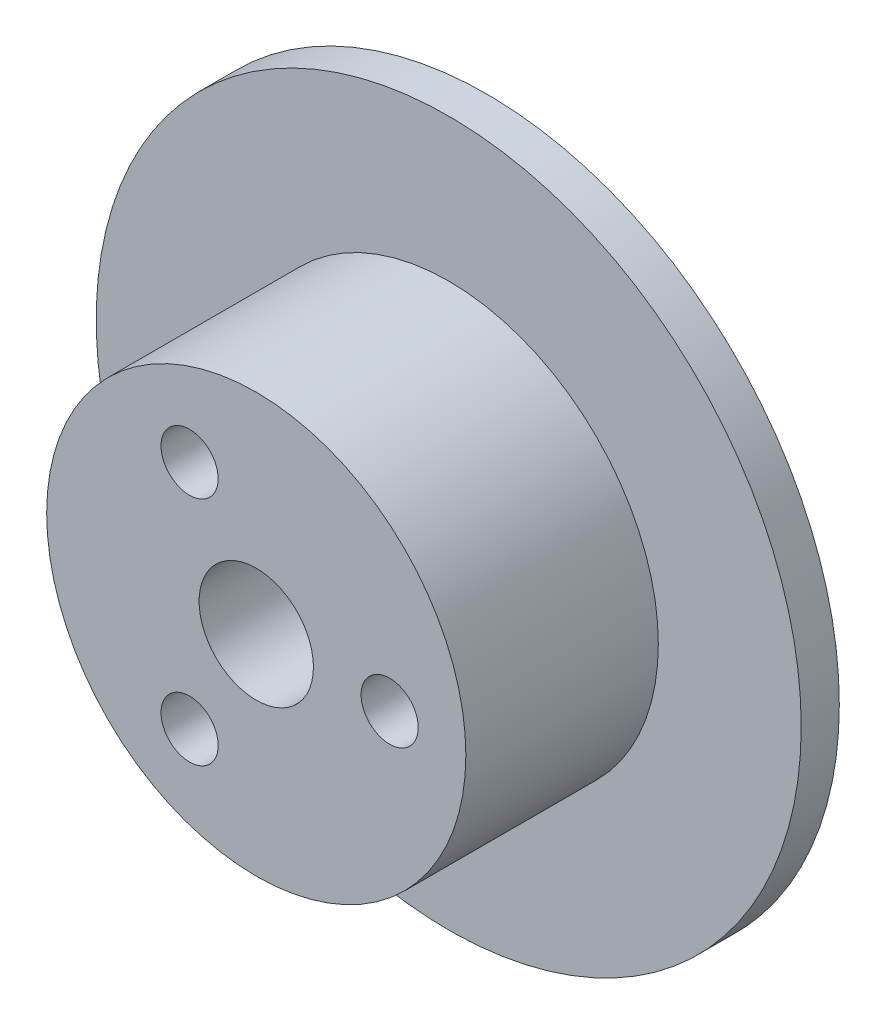
ISO-10303-21;
HEADER;
FILE_DESCRIPTION(('STEP AP214'),'2;1');
FILE_NAME('part.step','',(''),(''),'','','');
FILE_SCHEMA(('AUTOMOTIVE_DESIGN { 1 0 10303 214 1 1 1 1 }'));
ENDSEC;
DATA;
#1=APPLICATION_CONTEXT('core data for automotive mechanical design processes');
#2=APPLICATION_PROTOCOL_DEFINITION('international standard','automotive_design',2000,#1);
#3=PRODUCT_CONTEXT('',#1,'mechanical');
#4=PRODUCT('Part','Part','',(#3));
#5=PRODUCT_RELATED_PRODUCT_CATEGORY('part','',(#4));
#6=PRODUCT_DEFINITION_FORMATION('','',#4);
#7=PRODUCT_DEFINITION_CONTEXT('part definition',#1,'design');
#8=PRODUCT_DEFINITION('design','',#6,#7);
#9=PRODUCT_DEFINITION_SHAPE('','',#8);
#10=(LENGTH_UNIT() NAMED_UNIT(*) SI_UNIT(.MILLI.,.METRE.));
#11=(NAMED_UNIT(*) PLANE_ANGLE_UNIT() SI_UNIT($,.RADIAN.));
#12=(NAMED_UNIT(*) SI_UNIT($,.STERADIAN.) SOLID_ANGLE_UNIT());
#13=UNCERTAINTY_MEASURE_WITH_UNIT(LENGTH_MEASURE(1.E-05),#10,'distance_accuracy_value','');
#14=(GEOMETRIC_REPRESENTATION_CONTEXT(3) GLOBAL_UNCERTAINTY_ASSIGNED_CONTEXT((#13)) GLOBAL_UNIT_ASSIGNED_CONTEXT((#10,
#11,#12)) REPRESENTATION_CONTEXT('',''));
#15=CARTESIAN_POINT('',(0.,0.,0.));
#16=DIRECTION('',(0.,0.,1.));
#17=DIRECTION('',(1.,0.,0.));
#18=AXIS2_PLACEMENT_3D('',#15,#16,#17);
#19=CARTESIAN_POINT('',(0.,0.,3.));
#20=DIRECTION('',(0.,0.,-1.));
#21=DIRECTION('',(-1.,0.,0.));
#22=AXIS2_PLACEMENT_3D('',#19,#20,#21);
#23=CYLINDRICAL_SURFACE('',#22,18.5);
#24=CARTESIAN_POINT('',(0.,0.,0.));
#25=DIRECTION('',(0.,0.,1.));
#26=DIRECTION('',(1.,0.,0.));
#27=AXIS2_PLACEMENT_3D('',#24,#25,#26);
#28=CIRCLE('',#27,18.5);
#29=CARTESIAN_POINT('',(18.5,0.,0.));
#30=VERTEX_POINT('',#29);
#31=EDGE_CURVE('E11',#30,#30,#28,.T.);
#32=ORIENTED_EDGE('',*,*,#31,.T.);
#33=EDGE_LOOP('',(#32));
#34=FACE_BOUND('',#33,.T.);
#35=CARTESIAN_POINT('',(0.,0.,2.));
#36=DIRECTION('',(0.,0.,1.));
#37=DIRECTION('',(1.,0.,0.));
#38=AXIS2_PLACEMENT_3D('',#35,#36,#37);
#39=CIRCLE('',#38,18.5);
#40=CARTESIAN_POINT('',(18.5,0.,2.));
#41=VERTEX_POINT('',#40);
#42=EDGE_CURVE('E82',#41,#41,#39,.T.);
#43=ORIENTED_EDGE('',*,*,#42,.F.);
#44=EDGE_LOOP('',(#43));
#45=FACE_BOUND('',#44,.T.);
#46=ADVANCED_FACE('F45',(#34,#45),#23,.T.);
#47=CARTESIAN_POINT('',(0.,0.,0.));
#48=DIRECTION('',(0.,0.,1.));
#49=DIRECTION('',(1.,0.,0.));
#50=AXIS2_PLACEMENT_3D('',#47,#48,#49);
#51=PLANE('',#50);
#52=CARTESIAN_POINT('',(7.,0.,0.));
#53=DIRECTION('',(0.,0.,1.));
#54=DIRECTION('',(1.,0.,0.));
#55=AXIS2_PLACEMENT_3D('',#52,#53,#54);
#56=CIRCLE('',#55,1.5);
#57=CARTESIAN_POINT('',(8.5,0.,0.));
#58=VERTEX_POINT('',#57);
#59=EDGE_CURVE('E73',#58,#58,#56,.T.);
#60=ORIENTED_EDGE('',*,*,#59,.T.);
#61=EDGE_LOOP('',(#60));
#62=FACE_BOUND('',#61,.T.);
#63=CARTESIAN_POINT('',(-3.50000000000003,-6.06217782649106,0.));
#64=DIRECTION('',(0.,0.,1.));
#65=DIRECTION('',(1.,0.,0.));
#66=AXIS2_PLACEMENT_3D('',#63,#64,#65);
#67=CIRCLE('',#66,1.5);
#68=CARTESIAN_POINT('',(-2.00000000000003,-6.06217782649106,0.));
#69=VERTEX_POINT('',#68);
#70=EDGE_CURVE('E90',#69,#69,#67,.T.);
#71=ORIENTED_EDGE('',*,*,#70,.T.);
#72=EDGE_LOOP('',(#71));
#73=FACE_BOUND('',#72,.T.);
#74=CARTESIAN_POINT('',(-3.49999999999994,6.06217782649111,0.));
#75=DIRECTION('',(0.,0.,1.));
#76=DIRECTION('',(1.,0.,0.));
#77=AXIS2_PLACEMENT_3D('',#74,#75,#76);
#78=CIRCLE('',#77,1.5);
#79=CARTESIAN_POINT('',(-1.99999999999994,6.06217782649111,0.));
#80=VERTEX_POINT('',#79);
#81=EDGE_CURVE('E81',#80,#80,#78,.T.);
#82=ORIENTED_EDGE('',*,*,#81,.T.);
#83=EDGE_LOOP('',(#82));
#84=FACE_BOUND('',#83,.T.);
#85=CARTESIAN_POINT('',(0.,0.,0.));
#86=DIRECTION('',(0.,0.,-1.));
#87=DIRECTION('',(-1.,0.,0.));
#88=AXIS2_PLACEMENT_3D('',#85,#86,#87);
#89=CIRCLE('',#88,3.05);
#90=CARTESIAN_POINT('',(-3.05,0.,0.));
#91=VERTEX_POINT('',#90);
#92=EDGE_CURVE('E57',#91,#91,#89,.T.);
#93=ORIENTED_EDGE('',*,*,#92,.F.);
#94=EDGE_LOOP('',(#93));
#95=FACE_BOUND('',#94,.T.);
#96=ORIENTED_EDGE('',*,*,#31,.F.);
#97=EDGE_LOOP('',(#96));
#98=FACE_BOUND('',#97,.T.);
#99=ADVANCED_FACE('F119',(#62,#73,#84,#95,#98),#51,.F.);
#100=CARTESIAN_POINT('',(0.,0.,5.5));
#101=DIRECTION('',(0.,0.,-1.));
#102=DIRECTION('',(-1.,0.,0.));
#103=AXIS2_PLACEMENT_3D('',#100,#101,#102);
#104=CYLINDRICAL_SURFACE('',#103,11.);
#105=CARTESIAN_POINT('',(0.,0.,12.1));
#106=DIRECTION('',(0.,0.,1.));
#107=DIRECTION('',(1.,0.,0.));
#108=AXIS2_PLACEMENT_3D('',#105,#106,#107);
#109=CIRCLE('',#108,11.);
#110=CARTESIAN_POINT('',(11.,0.,12.1));
#111=VERTEX_POINT('',#110);
#112=EDGE_CURVE('E63',#111,#111,#109,.T.);
#113=ORIENTED_EDGE('',*,*,#112,.F.);
#114=EDGE_LOOP('',(#113));
#115=FACE_BOUND('',#114,.T.);
#116=CARTESIAN_POINT('',(0.,0.,2.));
#117=DIRECTION('',(0.,0.,1.));
#118=DIRECTION('',(1.,0.,0.));
#119=AXIS2_PLACEMENT_3D('',#116,#117,#118);
#120=CIRCLE('',#119,11.);
#121=CARTESIAN_POINT('',(11.,0.,2.));
#122=VERTEX_POINT('',#121);
#123=EDGE_CURVE('E104',#122,#122,#120,.T.);
#124=ORIENTED_EDGE('',*,*,#123,.T.);
#125=EDGE_LOOP('',(#124));
#126=FACE_BOUND('',#125,.T.);
#127=ADVANCED_FACE('F109',(#115,#126),#104,.T.);
#128=CARTESIAN_POINT('',(0.,0.,5.5));
#129=DIRECTION('',(0.,0.,-1.));
#130=DIRECTION('',(-1.,0.,0.));
#131=AXIS2_PLACEMENT_3D('',#128,#129,#130);
#132=CYLINDRICAL_SURFACE('',#131,3.05);
#133=CARTESIAN_POINT('',(0.,0.,5.5));
#134=DIRECTION('',(0.,0.,-1.));
#135=DIRECTION('',(-1.,0.,0.));
#136=AXIS2_PLACEMENT_3D('',#133,#134,#135);
#137=CIRCLE('',#136,3.05);
#138=CARTESIAN_POINT('',(-3.05,0.,5.5));
#139=VERTEX_POINT('',#138);
#140=EDGE_CURVE('E52',#139,#139,#137,.T.);
#141=ORIENTED_EDGE('',*,*,#140,.F.);
#142=EDGE_LOOP('',(#141));
#143=FACE_BOUND('',#142,.T.);
#144=ORIENTED_EDGE('',*,*,#92,.T.);
#145=EDGE_LOOP('',(#144));
#146=FACE_BOUND('',#145,.T.);
#147=ADVANCED_FACE('F127',(#143,#146),#132,.F.);
#148=CARTESIAN_POINT('',(0.,0.,5.5));
#149=DIRECTION('',(0.,0.,1.));
#150=DIRECTION('',(1.,0.,0.));
#151=AXIS2_PLACEMENT_3D('',#148,#149,#150);
#152=PLANE('',#151);
#153=CARTESIAN_POINT('',(0.,0.,5.5));
#154=DIRECTION('',(0.,0.,1.));
#155=DIRECTION('',(1.,0.,0.));
#156=AXIS2_PLACEMENT_3D('',#153,#154,#155);
#157=CIRCLE('',#156,3.);
#158=CARTESIAN_POINT('',(3.,0.,5.5));
#159=VERTEX_POINT('',#158);
#160=EDGE_CURVE('E69',#159,#159,#157,.T.);
#161=ORIENTED_EDGE('',*,*,#160,.T.);
#162=EDGE_LOOP('',(#161));
#163=FACE_BOUND('',#162,.T.);
#164=ORIENTED_EDGE('',*,*,#140,.T.);
#165=EDGE_LOOP('',(#164));
#166=FACE_BOUND('',#165,.T.);
#167=ADVANCED_FACE('F134',(#163,#166),#152,.F.);
#168=CARTESIAN_POINT('',(0.,0.,12.1));
#169=DIRECTION('',(0.,0.,1.));
#170=DIRECTION('',(1.,0.,0.));
#171=AXIS2_PLACEMENT_3D('',#168,#169,#170);
#172=PLANE('',#171);
#173=CARTESIAN_POINT('',(7.,0.,12.1));
#174=DIRECTION('',(0.,0.,1.));
#175=DIRECTION('',(1.,0.,0.));
#176=AXIS2_PLACEMENT_3D('',#173,#174,#175);
#177=CIRCLE('',#176,1.5);
#178=CARTESIAN_POINT('',(8.5,0.,12.1));
#179=VERTEX_POINT('',#178);
#180=EDGE_CURVE('E94',#179,#179,#177,.T.);
#181=ORIENTED_EDGE('',*,*,#180,.F.);
#182=EDGE_LOOP('',(#181));
#183=FACE_BOUND('',#182,.T.);
#184=CARTESIAN_POINT('',(-3.50000000000003,-6.06217782649106,12.1));
#185=DIRECTION('',(0.,0.,1.));
#186=DIRECTION('',(1.,0.,0.));
#187=AXIS2_PLACEMENT_3D('',#184,#185,#186);
#188=CIRCLE('',#187,1.5);
#189=CARTESIAN_POINT('',(-2.00000000000003,-6.06217782649106,12.1));
#190=VERTEX_POINT('',#189);
#191=EDGE_CURVE('E86',#190,#190,#188,.T.);
#192=ORIENTED_EDGE('',*,*,#191,.F.);
#193=EDGE_LOOP('',(#192));
#194=FACE_BOUND('',#193,.T.);
#195=CARTESIAN_POINT('',(-3.49999999999994,6.06217782649111,12.1));
#196=DIRECTION('',(0.,0.,1.));
#197=DIRECTION('',(1.,0.,0.));
#198=AXIS2_PLACEMENT_3D('',#195,#196,#197);
#199=CIRCLE('',#198,1.5);
#200=CARTESIAN_POINT('',(-1.99999999999994,6.06217782649111,12.1));
#201=VERTEX_POINT('',#200);
#202=EDGE_CURVE('E77',#201,#201,#199,.T.);
#203=ORIENTED_EDGE('',*,*,#202,.F.);
#204=EDGE_LOOP('',(#203));
#205=FACE_BOUND('',#204,.T.);
#206=ORIENTED_EDGE('',*,*,#112,.T.);
#207=EDGE_LOOP('',(#206));
#208=FACE_BOUND('',#207,.T.);
#209=CARTESIAN_POINT('',(0.,0.,12.1));
#210=DIRECTION('',(0.,0.,1.));
#211=DIRECTION('',(1.,0.,0.));
#212=AXIS2_PLACEMENT_3D('',#209,#210,#211);
#213=CIRCLE('',#212,3.);
#214=CARTESIAN_POINT('',(3.,0.,12.1));
#215=VERTEX_POINT('',#214);
#216=EDGE_CURVE('E68',#215,#215,#213,.T.);
#217=ORIENTED_EDGE('',*,*,#216,.F.);
#218=EDGE_LOOP('',(#217));
#219=FACE_BOUND('',#218,.T.);
#220=ADVANCED_FACE('F138',(#183,#194,#205,#208,#219),#172,.T.);
#221=CARTESIAN_POINT('',(0.,0.,12.1));
#222=DIRECTION('',(0.,0.,-1.));
#223=DIRECTION('',(-1.,0.,0.));
#224=AXIS2_PLACEMENT_3D('',#221,#222,#223);
#225=CYLINDRICAL_SURFACE('',#224,3.);
#226=ORIENTED_EDGE('',*,*,#216,.T.);
#227=EDGE_LOOP('',(#226));
#228=FACE_BOUND('',#227,.T.);
#229=ORIENTED_EDGE('',*,*,#160,.F.);
#230=EDGE_LOOP('',(#229));
#231=FACE_BOUND('',#230,.T.);
#232=ADVANCED_FACE('F142',(#228,#231),#225,.F.);
#233=CARTESIAN_POINT('',(-3.49999999999994,6.06217782649111,0.));
#234=DIRECTION('',(0.,0.,1.));
#235=DIRECTION('',(1.,0.,0.));
#236=AXIS2_PLACEMENT_3D('',#233,#234,#235);
#237=CYLINDRICAL_SURFACE('',#236,1.5);
#238=ORIENTED_EDGE('',*,*,#81,.F.);
#239=EDGE_LOOP('',(#238));
#240=FACE_BOUND('',#239,.T.);
#241=ORIENTED_EDGE('',*,*,#202,.T.);
#242=EDGE_LOOP('',(#241));
#243=FACE_BOUND('',#242,.T.);
#244=ADVANCED_FACE('F146',(#240,#243),#237,.F.);
#245=CARTESIAN_POINT('',(-3.50000000000003,-6.06217782649106,0.));
#246=DIRECTION('',(0.,0.,1.));
#247=DIRECTION('',(1.,0.,0.));
#248=AXIS2_PLACEMENT_3D('',#245,#246,#247);
#249=CYLINDRICAL_SURFACE('',#248,1.5);
#250=ORIENTED_EDGE('',*,*,#70,.F.);
#251=EDGE_LOOP('',(#250));
#252=FACE_BOUND('',#251,.T.);
#253=ORIENTED_EDGE('',*,*,#191,.T.);
#254=EDGE_LOOP('',(#253));
#255=FACE_BOUND('',#254,.T.);
#256=ADVANCED_FACE('F150',(#252,#255),#249,.F.);
#257=CARTESIAN_POINT('',(7.,0.,0.));
#258=DIRECTION('',(0.,0.,1.));
#259=DIRECTION('',(1.,0.,0.));
#260=AXIS2_PLACEMENT_3D('',#257,#258,#259);
#261=CYLINDRICAL_SURFACE('',#260,1.5);
#262=ORIENTED_EDGE('',*,*,#59,.F.);
#263=EDGE_LOOP('',(#262));
#264=FACE_BOUND('',#263,.T.);
#265=ORIENTED_EDGE('',*,*,#180,.T.);
#266=EDGE_LOOP('',(#265));
#267=FACE_BOUND('',#266,.T.);
#268=ADVANCED_FACE('F114',(#264,#267),#261,.F.);
#269=CARTESIAN_POINT('',(0.,0.,2.));
#270=DIRECTION('',(0.,0.,1.));
#271=DIRECTION('',(1.,0.,0.));
#272=AXIS2_PLACEMENT_3D('',#269,#270,#271);
#273=PLANE('',#272);
#274=ORIENTED_EDGE('',*,*,#123,.F.);
#275=EDGE_LOOP('',(#274));
#276=FACE_BOUND('',#275,.T.);
#277=ORIENTED_EDGE('',*,*,#42,.T.);
#278=EDGE_LOOP('',(#277));
#279=FACE_BOUND('',#278,.T.);
#280=ADVANCED_FACE('F111',(#276,#279),#273,.T.);
#281=CLOSED_SHELL('',(#46,#99,#127,#147,#167,#220,#232,#244,#256,#268,#280));
#282=MANIFOLD_SOLID_BREP('B2',#281);
#283=ADVANCED_BREP_SHAPE_REPRESENTATION('',(#18,#282),#14);
#284=SHAPE_DEFINITION_REPRESENTATION(#9,#283);
ENDSEC;
END-ISO-10303-21;
